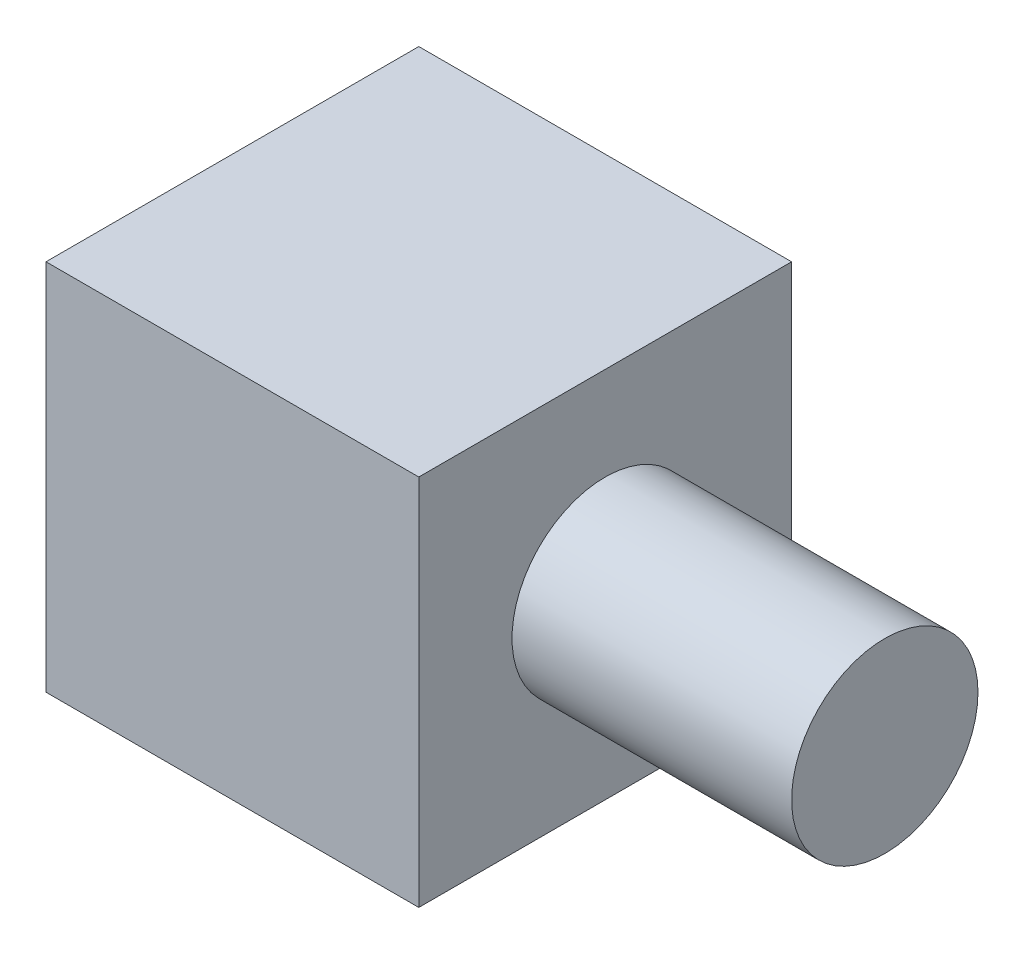
ISO-10303-21;
HEADER;
FILE_DESCRIPTION(('STEP AP214'),'2;1');
FILE_NAME('part.step','',(''),(''),'','','');
FILE_SCHEMA(('AUTOMOTIVE_DESIGN { 1 0 10303 214 1 1 1 1 }'));
ENDSEC;
DATA;
#1=APPLICATION_CONTEXT('core data for automotive mechanical design processes');
#2=APPLICATION_PROTOCOL_DEFINITION('international standard','automotive_design',2000,#1);
#3=PRODUCT_CONTEXT('',#1,'mechanical');
#4=PRODUCT('Part','Part','',(#3));
#5=PRODUCT_RELATED_PRODUCT_CATEGORY('part','',(#4));
#6=PRODUCT_DEFINITION_FORMATION('','',#4);
#7=PRODUCT_DEFINITION_CONTEXT('part definition',#1,'design');
#8=PRODUCT_DEFINITION('design','',#6,#7);
#9=PRODUCT_DEFINITION_SHAPE('','',#8);
#10=(LENGTH_UNIT() NAMED_UNIT(*) SI_UNIT(.MILLI.,.METRE.));
#11=(NAMED_UNIT(*) PLANE_ANGLE_UNIT() SI_UNIT($,.RADIAN.));
#12=(NAMED_UNIT(*) SI_UNIT($,.STERADIAN.) SOLID_ANGLE_UNIT());
#13=UNCERTAINTY_MEASURE_WITH_UNIT(LENGTH_MEASURE(1.E-05),#10,'distance_accuracy_value','');
#14=(GEOMETRIC_REPRESENTATION_CONTEXT(3) GLOBAL_UNCERTAINTY_ASSIGNED_CONTEXT((#13)) GLOBAL_UNIT_ASSIGNED_CONTEXT((#10,
#11,#12)) REPRESENTATION_CONTEXT('',''));
#15=CARTESIAN_POINT('',(0.,0.,0.));
#16=DIRECTION('',(0.,0.,1.));
#17=DIRECTION('',(1.,0.,0.));
#18=AXIS2_PLACEMENT_3D('',#15,#16,#17);
#19=CARTESIAN_POINT('',(50.,-50.,100.));
#20=DIRECTION('',(-1.,0.,0.));
#21=DIRECTION('',(0.,0.,1.));
#22=AXIS2_PLACEMENT_3D('',#19,#20,#21);
#23=PLANE('',#22);
#24=CARTESIAN_POINT('',(50.,0.,50.));
#25=DIRECTION('',(1.,0.,0.));
#26=DIRECTION('',(0.,0.,-1.));
#27=AXIS2_PLACEMENT_3D('',#24,#25,#26);
#28=CIRCLE('',#27,25.);
#29=CARTESIAN_POINT('',(50.,0.,25.));
#30=VERTEX_POINT('',#29);
#31=EDGE_CURVE('E11',#30,#30,#28,.T.);
#32=ORIENTED_EDGE('',*,*,#31,.F.);
#33=EDGE_LOOP('',(#32));
#34=FACE_BOUND('',#33,.T.);
#35=DIRECTION('',(0.,1.,0.));
#36=VECTOR('',#35,1.);
#37=CARTESIAN_POINT('',(50.,-50.,0.));
#38=LINE('',#37,#36);
#39=CARTESIAN_POINT('',(50.,-50.,0.));
#40=VERTEX_POINT('',#39);
#41=CARTESIAN_POINT('',(50.,50.,0.));
#42=VERTEX_POINT('',#41);
#43=EDGE_CURVE('E106',#40,#42,#38,.T.);
#44=ORIENTED_EDGE('',*,*,#43,.T.);
#45=DIRECTION('',(0.,0.,-1.));
#46=VECTOR('',#45,1.);
#47=CARTESIAN_POINT('',(50.,50.,100.));
#48=LINE('',#47,#46);
#49=CARTESIAN_POINT('',(50.,50.,100.));
#50=VERTEX_POINT('',#49);
#51=EDGE_CURVE('E43',#50,#42,#48,.T.);
#52=ORIENTED_EDGE('',*,*,#51,.F.);
#53=DIRECTION('',(0.,1.,0.));
#54=VECTOR('',#53,1.);
#55=CARTESIAN_POINT('',(50.,-50.,100.));
#56=LINE('',#55,#54);
#57=CARTESIAN_POINT('',(50.,-50.,100.));
#58=VERTEX_POINT('',#57);
#59=EDGE_CURVE('E93',#58,#50,#56,.T.);
#60=ORIENTED_EDGE('',*,*,#59,.F.);
#61=DIRECTION('',(0.,0.,-1.));
#62=VECTOR('',#61,1.);
#63=CARTESIAN_POINT('',(50.,-50.,100.));
#64=LINE('',#63,#62);
#65=EDGE_CURVE('E102',#58,#40,#64,.T.);
#66=ORIENTED_EDGE('',*,*,#65,.T.);
#67=EDGE_LOOP('',(#44,#52,#60,#66));
#68=FACE_BOUND('',#67,.T.);
#69=ADVANCED_FACE('F40',(#34,#68),#23,.F.);
#70=CARTESIAN_POINT('',(-50.,50.,100.));
#71=DIRECTION('',(0.,-1.,0.));
#72=DIRECTION('',(0.,0.,-1.));
#73=AXIS2_PLACEMENT_3D('',#70,#71,#72);
#74=PLANE('',#73);
#75=DIRECTION('',(-1.,0.,0.));
#76=VECTOR('',#75,1.);
#77=CARTESIAN_POINT('',(-50.,50.,0.));
#78=LINE('',#77,#76);
#79=CARTESIAN_POINT('',(-50.,50.,0.));
#80=VERTEX_POINT('',#79);
#81=EDGE_CURVE('E98',#42,#80,#78,.T.);
#82=ORIENTED_EDGE('',*,*,#81,.T.);
#83=DIRECTION('',(0.,0.,-1.));
#84=VECTOR('',#83,1.);
#85=CARTESIAN_POINT('',(-50.,50.,100.));
#86=LINE('',#85,#84);
#87=CARTESIAN_POINT('',(-50.,50.,100.));
#88=VERTEX_POINT('',#87);
#89=EDGE_CURVE('E96',#88,#80,#86,.T.);
#90=ORIENTED_EDGE('',*,*,#89,.F.);
#91=DIRECTION('',(-1.,0.,0.));
#92=VECTOR('',#91,1.);
#93=CARTESIAN_POINT('',(-50.,50.,100.));
#94=LINE('',#93,#92);
#95=EDGE_CURVE('E88',#50,#88,#94,.T.);
#96=ORIENTED_EDGE('',*,*,#95,.F.);
#97=ORIENTED_EDGE('',*,*,#51,.T.);
#98=EDGE_LOOP('',(#82,#90,#96,#97));
#99=FACE_BOUND('',#98,.T.);
#100=ADVANCED_FACE('F97',(#99),#74,.F.);
#101=CARTESIAN_POINT('',(-50.,-50.,100.));
#102=DIRECTION('',(1.,0.,0.));
#103=DIRECTION('',(0.,0.,-1.));
#104=AXIS2_PLACEMENT_3D('',#101,#102,#103);
#105=PLANE('',#104);
#106=DIRECTION('',(0.,-1.,0.));
#107=VECTOR('',#106,1.);
#108=CARTESIAN_POINT('',(-50.,-50.,0.));
#109=LINE('',#108,#107);
#110=CARTESIAN_POINT('',(-50.,-50.,0.));
#111=VERTEX_POINT('',#110);
#112=EDGE_CURVE('E74',#80,#111,#109,.T.);
#113=ORIENTED_EDGE('',*,*,#112,.T.);
#114=DIRECTION('',(0.,0.,-1.));
#115=VECTOR('',#114,1.);
#116=CARTESIAN_POINT('',(-50.,-50.,100.));
#117=LINE('',#116,#115);
#118=CARTESIAN_POINT('',(-50.,-50.,100.));
#119=VERTEX_POINT('',#118);
#120=EDGE_CURVE('E99',#119,#111,#117,.T.);
#121=ORIENTED_EDGE('',*,*,#120,.F.);
#122=DIRECTION('',(0.,-1.,0.));
#123=VECTOR('',#122,1.);
#124=CARTESIAN_POINT('',(-50.,-50.,100.));
#125=LINE('',#124,#123);
#126=EDGE_CURVE('E91',#88,#119,#125,.T.);
#127=ORIENTED_EDGE('',*,*,#126,.F.);
#128=ORIENTED_EDGE('',*,*,#89,.T.);
#129=EDGE_LOOP('',(#113,#121,#127,#128));
#130=FACE_BOUND('',#129,.T.);
#131=ADVANCED_FACE('F100',(#130),#105,.F.);
#132=CARTESIAN_POINT('',(-50.,-50.,100.));
#133=DIRECTION('',(0.,1.,0.));
#134=DIRECTION('',(0.,0.,1.));
#135=AXIS2_PLACEMENT_3D('',#132,#133,#134);
#136=PLANE('',#135);
#137=DIRECTION('',(1.,0.,0.));
#138=VECTOR('',#137,1.);
#139=CARTESIAN_POINT('',(-50.,-50.,0.));
#140=LINE('',#139,#138);
#141=EDGE_CURVE('E80',#111,#40,#140,.T.);
#142=ORIENTED_EDGE('',*,*,#141,.T.);
#143=ORIENTED_EDGE('',*,*,#65,.F.);
#144=DIRECTION('',(1.,0.,0.));
#145=VECTOR('',#144,1.);
#146=CARTESIAN_POINT('',(-50.,-50.,100.));
#147=LINE('',#146,#145);
#148=EDGE_CURVE('E57',#119,#58,#147,.T.);
#149=ORIENTED_EDGE('',*,*,#148,.F.);
#150=ORIENTED_EDGE('',*,*,#120,.T.);
#151=EDGE_LOOP('',(#142,#143,#149,#150));
#152=FACE_BOUND('',#151,.T.);
#153=ADVANCED_FACE('F114',(#152),#136,.F.);
#154=CARTESIAN_POINT('',(0.,0.,100.));
#155=DIRECTION('',(0.,0.,-1.));
#156=DIRECTION('',(-1.,0.,0.));
#157=AXIS2_PLACEMENT_3D('',#154,#155,#156);
#158=PLANE('',#157);
#159=ORIENTED_EDGE('',*,*,#59,.T.);
#160=ORIENTED_EDGE('',*,*,#95,.T.);
#161=ORIENTED_EDGE('',*,*,#126,.T.);
#162=ORIENTED_EDGE('',*,*,#148,.T.);
#163=EDGE_LOOP('',(#159,#160,#161,#162));
#164=FACE_BOUND('',#163,.T.);
#165=ADVANCED_FACE('F89',(#164),#158,.F.);
#166=CARTESIAN_POINT('',(0.,0.,0.));
#167=DIRECTION('',(0.,0.,-1.));
#168=DIRECTION('',(-1.,0.,0.));
#169=AXIS2_PLACEMENT_3D('',#166,#167,#168);
#170=PLANE('',#169);
#171=ORIENTED_EDGE('',*,*,#43,.F.);
#172=ORIENTED_EDGE('',*,*,#141,.F.);
#173=ORIENTED_EDGE('',*,*,#112,.F.);
#174=ORIENTED_EDGE('',*,*,#81,.F.);
#175=EDGE_LOOP('',(#171,#172,#173,#174));
#176=FACE_BOUND('',#175,.T.);
#177=ADVANCED_FACE('F117',(#176),#170,.T.);
#178=CARTESIAN_POINT('',(125.,0.,50.));
#179=DIRECTION('',(-1.,0.,0.));
#180=DIRECTION('',(0.,0.,1.));
#181=AXIS2_PLACEMENT_3D('',#178,#179,#180);
#182=CYLINDRICAL_SURFACE('',#181,25.);
#183=CARTESIAN_POINT('',(125.,0.,50.));
#184=DIRECTION('',(1.,0.,0.));
#185=DIRECTION('',(0.,0.,-1.));
#186=AXIS2_PLACEMENT_3D('',#183,#184,#185);
#187=CIRCLE('',#186,25.);
#188=CARTESIAN_POINT('',(125.,0.,25.));
#189=VERTEX_POINT('',#188);
#190=EDGE_CURVE('E109',#189,#189,#187,.T.);
#191=ORIENTED_EDGE('',*,*,#190,.F.);
#192=EDGE_LOOP('',(#191));
#193=FACE_BOUND('',#192,.T.);
#194=ORIENTED_EDGE('',*,*,#31,.T.);
#195=EDGE_LOOP('',(#194));
#196=FACE_BOUND('',#195,.T.);
#197=ADVANCED_FACE('F125',(#193,#196),#182,.T.);
#198=CARTESIAN_POINT('',(125.,0.,50.));
#199=DIRECTION('',(1.,0.,0.));
#200=DIRECTION('',(0.,0.,-1.));
#201=AXIS2_PLACEMENT_3D('',#198,#199,#200);
#202=PLANE('',#201);
#203=ORIENTED_EDGE('',*,*,#190,.T.);
#204=EDGE_LOOP('',(#203));
#205=FACE_BOUND('',#204,.T.);
#206=ADVANCED_FACE('F123',(#205),#202,.T.);
#207=CLOSED_SHELL('',(#69,#100,#131,#153,#165,#177,#197,#206));
#208=MANIFOLD_SOLID_BREP('B2',#207);
#209=ADVANCED_BREP_SHAPE_REPRESENTATION('',(#18,#208),#14);
#210=SHAPE_DEFINITION_REPRESENTATION(#9,#209);
ENDSEC;
END-ISO-10303-21;
